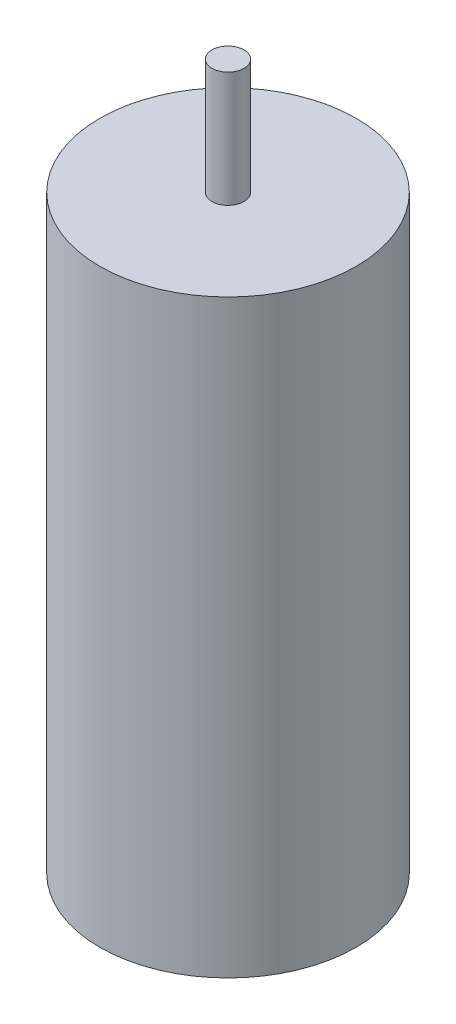
ISO-10303-21;
HEADER;
FILE_DESCRIPTION(('STEP AP214'),'2;1');
FILE_NAME('part.step','',(''),(''),'','','');
FILE_SCHEMA(('AUTOMOTIVE_DESIGN { 1 0 10303 214 1 1 1 1 }'));
ENDSEC;
DATA;
#1=APPLICATION_CONTEXT('core data for automotive mechanical design processes');
#2=APPLICATION_PROTOCOL_DEFINITION('international standard','automotive_design',2000,#1);
#3=PRODUCT_CONTEXT('',#1,'mechanical');
#4=PRODUCT('Part','Part','',(#3));
#5=PRODUCT_RELATED_PRODUCT_CATEGORY('part','',(#4));
#6=PRODUCT_DEFINITION_FORMATION('','',#4);
#7=PRODUCT_DEFINITION_CONTEXT('part definition',#1,'design');
#8=PRODUCT_DEFINITION('design','',#6,#7);
#9=PRODUCT_DEFINITION_SHAPE('','',#8);
#10=(LENGTH_UNIT() NAMED_UNIT(*) SI_UNIT(.MILLI.,.METRE.));
#11=(NAMED_UNIT(*) PLANE_ANGLE_UNIT() SI_UNIT($,.RADIAN.));
#12=(NAMED_UNIT(*) SI_UNIT($,.STERADIAN.) SOLID_ANGLE_UNIT());
#13=UNCERTAINTY_MEASURE_WITH_UNIT(LENGTH_MEASURE(1.E-05),#10,'distance_accuracy_value','');
#14=(GEOMETRIC_REPRESENTATION_CONTEXT(3) GLOBAL_UNCERTAINTY_ASSIGNED_CONTEXT((#13)) GLOBAL_UNIT_ASSIGNED_CONTEXT((#10,
#11,#12)) REPRESENTATION_CONTEXT('',''));
#15=CARTESIAN_POINT('',(0.,0.,0.));
#16=DIRECTION('',(0.,0.,1.));
#17=DIRECTION('',(1.,0.,0.));
#18=AXIS2_PLACEMENT_3D('',#15,#16,#17);
#19=CARTESIAN_POINT('',(0.,-40.3847165439492,0.));
#20=DIRECTION('',(0.,1.,0.));
#21=DIRECTION('',(0.,0.,1.));
#22=AXIS2_PLACEMENT_3D('',#19,#20,#21);
#23=PLANE('',#22);
#24=CARTESIAN_POINT('',(0.,-40.3847165439492,0.));
#25=DIRECTION('',(0.,1.,0.));
#26=DIRECTION('',(0.,0.,1.));
#27=AXIS2_PLACEMENT_3D('',#24,#25,#26);
#28=CIRCLE('',#27,20.);
#29=CARTESIAN_POINT('',(0.,-40.3847165439492,20.));
#30=VERTEX_POINT('',#29);
#31=EDGE_CURVE('E10',#30,#30,#28,.T.);
#32=ORIENTED_EDGE('',*,*,#31,.F.);
#33=EDGE_LOOP('',(#32));
#34=FACE_BOUND('',#33,.T.);
#35=ADVANCED_FACE('F38',(#34),#23,.F.);
#36=CARTESIAN_POINT('',(0.,88.1063335559378,0.));
#37=DIRECTION('',(0.,1.,0.));
#38=DIRECTION('',(0.,0.,1.));
#39=AXIS2_PLACEMENT_3D('',#36,#37,#38);
#40=CYLINDRICAL_SURFACE('',#39,20.);
#41=CARTESIAN_POINT('',(0.,51.6152834560508,0.));
#42=DIRECTION('',(0.,1.,0.));
#43=DIRECTION('',(0.,0.,1.));
#44=AXIS2_PLACEMENT_3D('',#41,#42,#43);
#45=CIRCLE('',#44,20.);
#46=CARTESIAN_POINT('',(0.,51.6152834560508,20.));
#47=VERTEX_POINT('',#46);
#48=EDGE_CURVE('E45',#47,#47,#45,.T.);
#49=ORIENTED_EDGE('',*,*,#48,.F.);
#50=EDGE_LOOP('',(#49));
#51=FACE_BOUND('',#50,.T.);
#52=ORIENTED_EDGE('',*,*,#31,.T.);
#53=EDGE_LOOP('',(#52));
#54=FACE_BOUND('',#53,.T.);
#55=ADVANCED_FACE('F67',(#51,#54),#40,.T.);
#56=CARTESIAN_POINT('',(20.,51.6152834560508,0.));
#57=DIRECTION('',(0.,-1.,0.));
#58=DIRECTION('',(0.,0.,-1.));
#59=AXIS2_PLACEMENT_3D('',#56,#57,#58);
#60=PLANE('',#59);
#61=CARTESIAN_POINT('',(0.,51.6152834560508,0.));
#62=DIRECTION('',(0.,1.,0.));
#63=DIRECTION('',(0.,0.,1.));
#64=AXIS2_PLACEMENT_3D('',#61,#62,#63);
#65=CIRCLE('',#64,2.5);
#66=CARTESIAN_POINT('',(0.,51.6152834560508,2.5));
#67=VERTEX_POINT('',#66);
#68=EDGE_CURVE('E46',#67,#67,#65,.T.);
#69=ORIENTED_EDGE('',*,*,#68,.F.);
#70=EDGE_LOOP('',(#69));
#71=FACE_BOUND('',#70,.T.);
#72=ORIENTED_EDGE('',*,*,#48,.T.);
#73=EDGE_LOOP('',(#72));
#74=FACE_BOUND('',#73,.T.);
#75=ADVANCED_FACE('F62',(#71,#74),#60,.F.);
#76=CARTESIAN_POINT('',(0.,88.1063335559378,0.));
#77=DIRECTION('',(0.,1.,0.));
#78=DIRECTION('',(0.,0.,1.));
#79=AXIS2_PLACEMENT_3D('',#76,#77,#78);
#80=CYLINDRICAL_SURFACE('',#79,2.5);
#81=CARTESIAN_POINT('',(0.,69.6152834560508,0.));
#82=DIRECTION('',(0.,1.,0.));
#83=DIRECTION('',(0.,0.,1.));
#84=AXIS2_PLACEMENT_3D('',#81,#82,#83);
#85=CIRCLE('',#84,2.5);
#86=CARTESIAN_POINT('',(0.,69.6152834560508,2.5));
#87=VERTEX_POINT('',#86);
#88=EDGE_CURVE('E49',#87,#87,#85,.T.);
#89=ORIENTED_EDGE('',*,*,#88,.F.);
#90=EDGE_LOOP('',(#89));
#91=FACE_BOUND('',#90,.T.);
#92=ORIENTED_EDGE('',*,*,#68,.T.);
#93=EDGE_LOOP('',(#92));
#94=FACE_BOUND('',#93,.T.);
#95=ADVANCED_FACE('F59',(#91,#94),#80,.T.);
#96=CARTESIAN_POINT('',(2.5,69.6152834560508,0.));
#97=DIRECTION('',(0.,-1.,0.));
#98=DIRECTION('',(0.,0.,-1.));
#99=AXIS2_PLACEMENT_3D('',#96,#97,#98);
#100=PLANE('',#99);
#101=ORIENTED_EDGE('',*,*,#88,.T.);
#102=EDGE_LOOP('',(#101));
#103=FACE_BOUND('',#102,.T.);
#104=ADVANCED_FACE('F57',(#103),#100,.F.);
#105=CLOSED_SHELL('',(#35,#55,#75,#95,#104));
#106=MANIFOLD_SOLID_BREP('B2',#105);
#107=ADVANCED_BREP_SHAPE_REPRESENTATION('',(#18,#106),#14);
#108=SHAPE_DEFINITION_REPRESENTATION(#9,#107);
ENDSEC;
END-ISO-10303-21;
